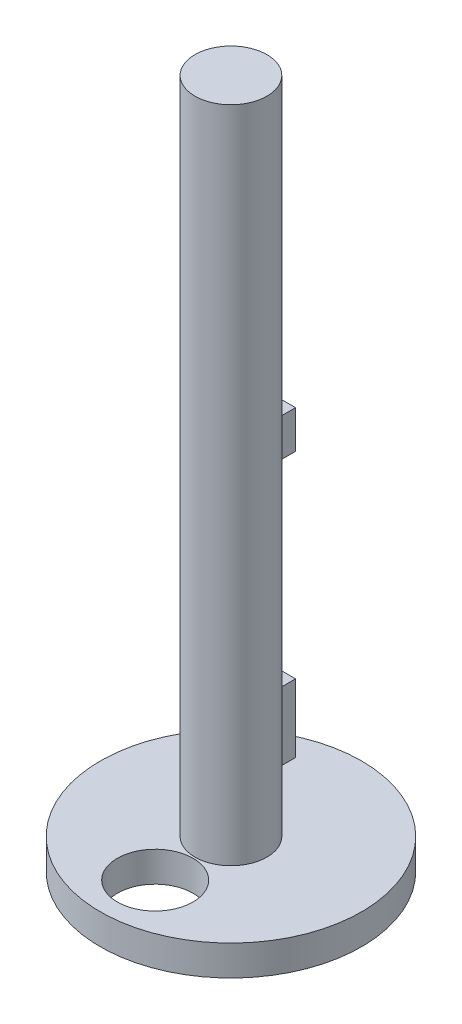
ISO-10303-21;
HEADER;
FILE_DESCRIPTION(('STEP AP214'),'2;1');
FILE_NAME('part.step','',(''),(''),'','','');
FILE_SCHEMA(('AUTOMOTIVE_DESIGN { 1 0 10303 214 1 1 1 1 }'));
ENDSEC;
DATA;
#1=APPLICATION_CONTEXT('core data for automotive mechanical design processes');
#2=APPLICATION_PROTOCOL_DEFINITION('international standard','automotive_design',2000,#1);
#3=PRODUCT_CONTEXT('',#1,'mechanical');
#4=PRODUCT('Part','Part','',(#3));
#5=PRODUCT_RELATED_PRODUCT_CATEGORY('part','',(#4));
#6=PRODUCT_DEFINITION_FORMATION('','',#4);
#7=PRODUCT_DEFINITION_CONTEXT('part definition',#1,'design');
#8=PRODUCT_DEFINITION('design','',#6,#7);
#9=PRODUCT_DEFINITION_SHAPE('','',#8);
#10=(LENGTH_UNIT() NAMED_UNIT(*) SI_UNIT(.MILLI.,.METRE.));
#11=(NAMED_UNIT(*) PLANE_ANGLE_UNIT() SI_UNIT($,.RADIAN.));
#12=(NAMED_UNIT(*) SI_UNIT($,.STERADIAN.) SOLID_ANGLE_UNIT());
#13=UNCERTAINTY_MEASURE_WITH_UNIT(LENGTH_MEASURE(1.E-05),#10,'distance_accuracy_value','');
#14=(GEOMETRIC_REPRESENTATION_CONTEXT(3) GLOBAL_UNCERTAINTY_ASSIGNED_CONTEXT((#13)) GLOBAL_UNIT_ASSIGNED_CONTEXT((#10,
#11,#12)) REPRESENTATION_CONTEXT('',''));
#15=CARTESIAN_POINT('',(0.,0.,0.));
#16=DIRECTION('',(0.,0.,1.));
#17=DIRECTION('',(1.,0.,0.));
#18=AXIS2_PLACEMENT_3D('',#15,#16,#17);
#19=CARTESIAN_POINT('',(0.,87.,0.));
#20=DIRECTION('',(0.,-1.,0.));
#21=DIRECTION('',(0.,0.,-1.));
#22=AXIS2_PLACEMENT_3D('',#19,#20,#21);
#23=CYLINDRICAL_SURFACE('',#22,4.75);
#24=CARTESIAN_POINT('',(0.,15.5,0.));
#25=DIRECTION('',(0.,-1.,0.));
#26=DIRECTION('',(0.,0.,-1.));
#27=AXIS2_PLACEMENT_3D('',#24,#25,#26);
#28=CIRCLE('',#27,4.75);
#29=CARTESIAN_POINT('',(-1.75,15.5,-4.41588043316392));
#30=VERTEX_POINT('',#29);
#31=CARTESIAN_POINT('',(1.75,15.5,-4.41588043316392));
#32=VERTEX_POINT('',#31);
#33=EDGE_CURVE('E172',#30,#32,#28,.T.);
#34=ORIENTED_EDGE('',*,*,#33,.F.);
#35=DIRECTION('',(0.,-1.,0.));
#36=VECTOR('',#35,1.);
#37=CARTESIAN_POINT('',(-1.75,87.,-4.41588043316392));
#38=LINE('',#37,#36);
#39=CARTESIAN_POINT('',(-1.75,6.50000000000001,-4.41588043316392));
#40=VERTEX_POINT('',#39);
#41=EDGE_CURVE('E170',#40,#30,#38,.F.);
#42=ORIENTED_EDGE('',*,*,#41,.F.);
#43=CARTESIAN_POINT('',(0.,6.50000000000001,0.));
#44=DIRECTION('',(0.,-1.,0.));
#45=DIRECTION('',(0.,0.,-1.));
#46=AXIS2_PLACEMENT_3D('',#43,#44,#45);
#47=CIRCLE('',#46,4.75);
#48=CARTESIAN_POINT('',(1.75,6.50000000000001,-4.41588043316392));
#49=VERTEX_POINT('',#48);
#50=EDGE_CURVE('E163',#40,#49,#47,.T.);
#51=ORIENTED_EDGE('',*,*,#50,.T.);
#52=DIRECTION('',(0.,-1.,0.));
#53=VECTOR('',#52,1.);
#54=CARTESIAN_POINT('',(1.75,87.,-4.41588043316392));
#55=LINE('',#54,#53);
#56=EDGE_CURVE('E168',#32,#49,#55,.T.);
#57=ORIENTED_EDGE('',*,*,#56,.F.);
#58=EDGE_LOOP('',(#34,#42,#51,#57));
#59=FACE_BOUND('',#58,.T.);
#60=CARTESIAN_POINT('',(0.,87.,0.));
#61=DIRECTION('',(0.,1.,0.));
#62=DIRECTION('',(0.,0.,1.));
#63=AXIS2_PLACEMENT_3D('',#60,#61,#62);
#64=CIRCLE('',#63,4.75);
#65=CARTESIAN_POINT('',(0.,87.,4.75));
#66=VERTEX_POINT('',#65);
#67=EDGE_CURVE('E160',#66,#66,#64,.T.);
#68=ORIENTED_EDGE('',*,*,#67,.F.);
#69=EDGE_LOOP('',(#68));
#70=FACE_BOUND('',#69,.T.);
#71=CARTESIAN_POINT('',(0.,0.,0.));
#72=DIRECTION('',(0.,1.,0.));
#73=DIRECTION('',(0.,0.,1.));
#74=AXIS2_PLACEMENT_3D('',#71,#72,#73);
#75=CIRCLE('',#74,4.75);
#76=CARTESIAN_POINT('',(0.,0.,4.75));
#77=VERTEX_POINT('',#76);
#78=EDGE_CURVE('E157',#77,#77,#75,.T.);
#79=ORIENTED_EDGE('',*,*,#78,.T.);
#80=EDGE_LOOP('',(#79));
#81=FACE_BOUND('',#80,.T.);
#82=CARTESIAN_POINT('',(0.,46.5,0.));
#83=DIRECTION('',(0.,-1.,0.));
#84=DIRECTION('',(0.,0.,-1.));
#85=AXIS2_PLACEMENT_3D('',#82,#83,#84);
#86=CIRCLE('',#85,4.75);
#87=CARTESIAN_POINT('',(-1.75,46.5,-4.41588043316392));
#88=VERTEX_POINT('',#87);
#89=CARTESIAN_POINT('',(1.75,46.5,-4.41588043316392));
#90=VERTEX_POINT('',#89);
#91=EDGE_CURVE('E11',#88,#90,#86,.T.);
#92=ORIENTED_EDGE('',*,*,#91,.F.);
#93=DIRECTION('',(0.,-1.,0.));
#94=VECTOR('',#93,1.);
#95=CARTESIAN_POINT('',(-1.75,87.,-4.41588043316392));
#96=LINE('',#95,#94);
#97=CARTESIAN_POINT('',(-1.75,41.5,-4.41588043316392));
#98=VERTEX_POINT('',#97);
#99=EDGE_CURVE('E42',#98,#88,#96,.F.);
#100=ORIENTED_EDGE('',*,*,#99,.F.);
#101=CARTESIAN_POINT('',(0.,41.5,0.));
#102=DIRECTION('',(0.,-1.,0.));
#103=DIRECTION('',(0.,0.,-1.));
#104=AXIS2_PLACEMENT_3D('',#101,#102,#103);
#105=CIRCLE('',#104,4.75);
#106=CARTESIAN_POINT('',(1.75,41.5,-4.41588043316392));
#107=VERTEX_POINT('',#106);
#108=EDGE_CURVE('E174',#98,#107,#105,.T.);
#109=ORIENTED_EDGE('',*,*,#108,.T.);
#110=DIRECTION('',(0.,-1.,0.));
#111=VECTOR('',#110,1.);
#112=CARTESIAN_POINT('',(1.75,87.,-4.41588043316392));
#113=LINE('',#112,#111);
#114=EDGE_CURVE('E177',#90,#107,#113,.T.);
#115=ORIENTED_EDGE('',*,*,#114,.F.);
#116=EDGE_LOOP('',(#92,#100,#109,#115));
#117=FACE_BOUND('',#116,.T.);
#118=ADVANCED_FACE('F35',(#59,#70,#81,#117),#23,.T.);
#119=CARTESIAN_POINT('',(0.,87.,0.));
#120=DIRECTION('',(0.,1.,0.));
#121=DIRECTION('',(0.,0.,1.));
#122=AXIS2_PLACEMENT_3D('',#119,#120,#121);
#123=PLANE('',#122);
#124=ORIENTED_EDGE('',*,*,#67,.T.);
#125=EDGE_LOOP('',(#124));
#126=FACE_BOUND('',#125,.T.);
#127=ADVANCED_FACE('F192',(#126),#123,.T.);
#128=CARTESIAN_POINT('',(0.,-4.,0.));
#129=DIRECTION('',(0.,1.,0.));
#130=DIRECTION('',(0.,0.,1.));
#131=AXIS2_PLACEMENT_3D('',#128,#129,#130);
#132=CYLINDRICAL_SURFACE('',#131,17.25);
#133=CARTESIAN_POINT('',(0.,-4.,0.));
#134=DIRECTION('',(0.,-1.,0.));
#135=DIRECTION('',(0.,0.,-1.));
#136=AXIS2_PLACEMENT_3D('',#133,#134,#135);
#137=CIRCLE('',#136,17.25);
#138=CARTESIAN_POINT('',(0.,-4.,-17.25));
#139=VERTEX_POINT('',#138);
#140=EDGE_CURVE('E154',#139,#139,#137,.T.);
#141=ORIENTED_EDGE('',*,*,#140,.F.);
#142=EDGE_LOOP('',(#141));
#143=FACE_BOUND('',#142,.T.);
#144=CARTESIAN_POINT('',(0.,0.,0.));
#145=DIRECTION('',(0.,-1.,0.));
#146=DIRECTION('',(0.,0.,-1.));
#147=AXIS2_PLACEMENT_3D('',#144,#145,#146);
#148=CIRCLE('',#147,17.25);
#149=CARTESIAN_POINT('',(0.,0.,-17.25));
#150=VERTEX_POINT('',#149);
#151=EDGE_CURVE('E151',#150,#150,#148,.T.);
#152=ORIENTED_EDGE('',*,*,#151,.T.);
#153=EDGE_LOOP('',(#152));
#154=FACE_BOUND('',#153,.T.);
#155=ADVANCED_FACE('F199',(#143,#154),#132,.T.);
#156=CARTESIAN_POINT('',(0.,-4.,0.));
#157=DIRECTION('',(0.,-1.,0.));
#158=DIRECTION('',(0.,0.,-1.));
#159=AXIS2_PLACEMENT_3D('',#156,#157,#158);
#160=PLANE('',#159);
#161=CARTESIAN_POINT('',(0.,-4.,10.));
#162=DIRECTION('',(0.,-1.,0.));
#163=DIRECTION('',(0.,0.,-1.));
#164=AXIS2_PLACEMENT_3D('',#161,#162,#163);
#165=CIRCLE('',#164,5.);
#166=CARTESIAN_POINT('',(0.,-4.,5.));
#167=VERTEX_POINT('',#166);
#168=EDGE_CURVE('E147',#167,#167,#165,.T.);
#169=ORIENTED_EDGE('',*,*,#168,.F.);
#170=EDGE_LOOP('',(#169));
#171=FACE_BOUND('',#170,.T.);
#172=ORIENTED_EDGE('',*,*,#140,.T.);
#173=EDGE_LOOP('',(#172));
#174=FACE_BOUND('',#173,.T.);
#175=ADVANCED_FACE('F213',(#171,#174),#160,.T.);
#176=CARTESIAN_POINT('',(0.,0.,0.));
#177=DIRECTION('',(0.,-1.,0.));
#178=DIRECTION('',(0.,0.,-1.));
#179=AXIS2_PLACEMENT_3D('',#176,#177,#178);
#180=PLANE('',#179);
#181=CARTESIAN_POINT('',(0.,0.,10.));
#182=DIRECTION('',(0.,-1.,0.));
#183=DIRECTION('',(0.,0.,-1.));
#184=AXIS2_PLACEMENT_3D('',#181,#182,#183);
#185=CIRCLE('',#184,5.);
#186=CARTESIAN_POINT('',(0.,0.,5.));
#187=VERTEX_POINT('',#186);
#188=EDGE_CURVE('E148',#187,#187,#185,.T.);
#189=ORIENTED_EDGE('',*,*,#188,.T.);
#190=EDGE_LOOP('',(#189));
#191=FACE_BOUND('',#190,.T.);
#192=ORIENTED_EDGE('',*,*,#78,.F.);
#193=EDGE_LOOP('',(#192));
#194=FACE_BOUND('',#193,.T.);
#195=ORIENTED_EDGE('',*,*,#151,.F.);
#196=EDGE_LOOP('',(#195));
#197=FACE_BOUND('',#196,.T.);
#198=ADVANCED_FACE('F209',(#191,#194,#197),#180,.F.);
#199=CARTESIAN_POINT('',(0.,0.,10.));
#200=DIRECTION('',(0.,-1.,0.));
#201=DIRECTION('',(0.,0.,-1.));
#202=AXIS2_PLACEMENT_3D('',#199,#200,#201);
#203=CYLINDRICAL_SURFACE('',#202,5.);
#204=ORIENTED_EDGE('',*,*,#188,.F.);
#205=EDGE_LOOP('',(#204));
#206=FACE_BOUND('',#205,.T.);
#207=ORIENTED_EDGE('',*,*,#168,.T.);
#208=EDGE_LOOP('',(#207));
#209=FACE_BOUND('',#208,.T.);
#210=ADVANCED_FACE('F212',(#206,#209),#203,.F.);
#211=CARTESIAN_POINT('',(-1.75,15.5,0.));
#212=DIRECTION('',(1.,0.,0.));
#213=DIRECTION('',(0.,0.,-1.));
#214=AXIS2_PLACEMENT_3D('',#211,#212,#213);
#215=PLANE('',#214);
#216=DIRECTION('',(0.,0.,1.));
#217=VECTOR('',#216,1.);
#218=CARTESIAN_POINT('',(-1.75,6.5,0.));
#219=LINE('',#218,#217);
#220=CARTESIAN_POINT('',(-1.75,6.5,-6.77772085586298));
#221=VERTEX_POINT('',#220);
#222=EDGE_CURVE('E113',#221,#40,#219,.T.);
#223=ORIENTED_EDGE('',*,*,#222,.T.);
#224=ORIENTED_EDGE('',*,*,#41,.T.);
#225=DIRECTION('',(0.,0.,1.));
#226=VECTOR('',#225,1.);
#227=CARTESIAN_POINT('',(-1.75,15.5,0.));
#228=LINE('',#227,#226);
#229=CARTESIAN_POINT('',(-1.75,15.5,-6.77772085586298));
#230=VERTEX_POINT('',#229);
#231=EDGE_CURVE('E129',#230,#30,#228,.T.);
#232=ORIENTED_EDGE('',*,*,#231,.F.);
#233=DIRECTION('',(0.,-1.,0.));
#234=VECTOR('',#233,1.);
#235=CARTESIAN_POINT('',(-1.75,15.5,-6.77772085586298));
#236=LINE('',#235,#234);
#237=EDGE_CURVE('E137',#230,#221,#236,.T.);
#238=ORIENTED_EDGE('',*,*,#237,.T.);
#239=EDGE_LOOP('',(#223,#224,#232,#238));
#240=FACE_BOUND('',#239,.T.);
#241=ADVANCED_FACE('F230',(#240),#215,.F.);
#242=CARTESIAN_POINT('',(1.75,15.5,0.));
#243=DIRECTION('',(-1.,0.,0.));
#244=DIRECTION('',(0.,0.,1.));
#245=AXIS2_PLACEMENT_3D('',#242,#243,#244);
#246=PLANE('',#245);
#247=DIRECTION('',(0.,0.,-1.));
#248=VECTOR('',#247,1.);
#249=CARTESIAN_POINT('',(1.75,15.5,0.));
#250=LINE('',#249,#248);
#251=CARTESIAN_POINT('',(1.75,15.5,-6.77772085586298));
#252=VERTEX_POINT('',#251);
#253=EDGE_CURVE('E132',#32,#252,#250,.T.);
#254=ORIENTED_EDGE('',*,*,#253,.F.);
#255=ORIENTED_EDGE('',*,*,#56,.T.);
#256=DIRECTION('',(0.,0.,-1.));
#257=VECTOR('',#256,1.);
#258=CARTESIAN_POINT('',(1.75,6.5,0.));
#259=LINE('',#258,#257);
#260=CARTESIAN_POINT('',(1.75,6.5,-6.77772085586298));
#261=VERTEX_POINT('',#260);
#262=EDGE_CURVE('E57',#49,#261,#259,.T.);
#263=ORIENTED_EDGE('',*,*,#262,.T.);
#264=DIRECTION('',(0.,-1.,0.));
#265=VECTOR('',#264,1.);
#266=CARTESIAN_POINT('',(1.75,15.5,-6.77772085586298));
#267=LINE('',#266,#265);
#268=EDGE_CURVE('E144',#252,#261,#267,.T.);
#269=ORIENTED_EDGE('',*,*,#268,.F.);
#270=EDGE_LOOP('',(#254,#255,#263,#269));
#271=FACE_BOUND('',#270,.T.);
#272=ADVANCED_FACE('F234',(#271),#246,.F.);
#273=CARTESIAN_POINT('',(-1.75,15.5,-6.77772085586298));
#274=DIRECTION('',(0.,0.,1.));
#275=DIRECTION('',(1.,0.,0.));
#276=AXIS2_PLACEMENT_3D('',#273,#274,#275);
#277=PLANE('',#276);
#278=DIRECTION('',(-1.,0.,0.));
#279=VECTOR('',#278,1.);
#280=CARTESIAN_POINT('',(-1.75,6.5,-6.77772085586298));
#281=LINE('',#280,#279);
#282=EDGE_CURVE('E133',#261,#221,#281,.T.);
#283=ORIENTED_EDGE('',*,*,#282,.T.);
#284=ORIENTED_EDGE('',*,*,#237,.F.);
#285=DIRECTION('',(-1.,0.,0.));
#286=VECTOR('',#285,1.);
#287=CARTESIAN_POINT('',(-1.75,15.5,-6.77772085586298));
#288=LINE('',#287,#286);
#289=EDGE_CURVE('E135',#252,#230,#288,.T.);
#290=ORIENTED_EDGE('',*,*,#289,.F.);
#291=ORIENTED_EDGE('',*,*,#268,.T.);
#292=EDGE_LOOP('',(#283,#284,#290,#291));
#293=FACE_BOUND('',#292,.T.);
#294=ADVANCED_FACE('F238',(#293),#277,.F.);
#295=CARTESIAN_POINT('',(0.,15.5,0.));
#296=DIRECTION('',(0.,-1.,0.));
#297=DIRECTION('',(0.,0.,-1.));
#298=AXIS2_PLACEMENT_3D('',#295,#296,#297);
#299=PLANE('',#298);
#300=ORIENTED_EDGE('',*,*,#231,.T.);
#301=ORIENTED_EDGE('',*,*,#33,.T.);
#302=ORIENTED_EDGE('',*,*,#253,.T.);
#303=ORIENTED_EDGE('',*,*,#289,.T.);
#304=EDGE_LOOP('',(#300,#301,#302,#303));
#305=FACE_BOUND('',#304,.T.);
#306=ADVANCED_FACE('F242',(#305),#299,.F.);
#307=CARTESIAN_POINT('',(0.,6.5,0.));
#308=DIRECTION('',(0.,-1.,0.));
#309=DIRECTION('',(0.,0.,-1.));
#310=AXIS2_PLACEMENT_3D('',#307,#308,#309);
#311=PLANE('',#310);
#312=ORIENTED_EDGE('',*,*,#50,.F.);
#313=ORIENTED_EDGE('',*,*,#222,.F.);
#314=ORIENTED_EDGE('',*,*,#282,.F.);
#315=ORIENTED_EDGE('',*,*,#262,.F.);
#316=EDGE_LOOP('',(#312,#313,#314,#315));
#317=FACE_BOUND('',#316,.T.);
#318=ADVANCED_FACE('F244',(#317),#311,.T.);
#319=CARTESIAN_POINT('',(-1.75,46.5,0.));
#320=DIRECTION('',(1.,0.,0.));
#321=DIRECTION('',(0.,0.,-1.));
#322=AXIS2_PLACEMENT_3D('',#319,#320,#321);
#323=PLANE('',#322);
#324=DIRECTION('',(0.,0.,1.));
#325=VECTOR('',#324,1.);
#326=CARTESIAN_POINT('',(-1.75,41.5,0.));
#327=LINE('',#326,#325);
#328=CARTESIAN_POINT('',(-1.75,41.5,-6.77772085586298));
#329=VERTEX_POINT('',#328);
#330=EDGE_CURVE('E123',#329,#98,#327,.T.);
#331=ORIENTED_EDGE('',*,*,#330,.T.);
#332=ORIENTED_EDGE('',*,*,#99,.T.);
#333=DIRECTION('',(0.,0.,1.));
#334=VECTOR('',#333,1.);
#335=CARTESIAN_POINT('',(-1.75,46.5,0.));
#336=LINE('',#335,#334);
#337=CARTESIAN_POINT('',(-1.75,46.5,-6.77772085586298));
#338=VERTEX_POINT('',#337);
#339=EDGE_CURVE('E107',#338,#88,#336,.T.);
#340=ORIENTED_EDGE('',*,*,#339,.F.);
#341=DIRECTION('',(0.,-1.,0.));
#342=VECTOR('',#341,1.);
#343=CARTESIAN_POINT('',(-1.75,46.5,-6.77772085586298));
#344=LINE('',#343,#342);
#345=EDGE_CURVE('E114',#338,#329,#344,.T.);
#346=ORIENTED_EDGE('',*,*,#345,.T.);
#347=EDGE_LOOP('',(#331,#332,#340,#346));
#348=FACE_BOUND('',#347,.T.);
#349=ADVANCED_FACE('F180',(#348),#323,.F.);
#350=CARTESIAN_POINT('',(1.75,46.5,0.));
#351=DIRECTION('',(-1.,0.,0.));
#352=DIRECTION('',(0.,0.,1.));
#353=AXIS2_PLACEMENT_3D('',#350,#351,#352);
#354=PLANE('',#353);
#355=DIRECTION('',(0.,0.,-1.));
#356=VECTOR('',#355,1.);
#357=CARTESIAN_POINT('',(1.75,46.5,0.));
#358=LINE('',#357,#356);
#359=CARTESIAN_POINT('',(1.75,46.5,-6.77772085586298));
#360=VERTEX_POINT('',#359);
#361=EDGE_CURVE('E97',#90,#360,#358,.T.);
#362=ORIENTED_EDGE('',*,*,#361,.F.);
#363=ORIENTED_EDGE('',*,*,#114,.T.);
#364=DIRECTION('',(0.,0.,-1.));
#365=VECTOR('',#364,1.);
#366=CARTESIAN_POINT('',(1.75,41.5,0.));
#367=LINE('',#366,#365);
#368=CARTESIAN_POINT('',(1.75,41.5,-6.77772085586298));
#369=VERTEX_POINT('',#368);
#370=EDGE_CURVE('E49',#107,#369,#367,.T.);
#371=ORIENTED_EDGE('',*,*,#370,.T.);
#372=DIRECTION('',(0.,-1.,0.));
#373=VECTOR('',#372,1.);
#374=CARTESIAN_POINT('',(1.75,46.5,-6.77772085586298));
#375=LINE('',#374,#373);
#376=EDGE_CURVE('E110',#360,#369,#375,.T.);
#377=ORIENTED_EDGE('',*,*,#376,.F.);
#378=EDGE_LOOP('',(#362,#363,#371,#377));
#379=FACE_BOUND('',#378,.T.);
#380=ADVANCED_FACE('F111',(#379),#354,.F.);
#381=CARTESIAN_POINT('',(-1.75,46.5,-6.77772085586298));
#382=DIRECTION('',(0.,0.,1.));
#383=DIRECTION('',(1.,0.,0.));
#384=AXIS2_PLACEMENT_3D('',#381,#382,#383);
#385=PLANE('',#384);
#386=DIRECTION('',(-1.,0.,0.));
#387=VECTOR('',#386,1.);
#388=CARTESIAN_POINT('',(-1.75,41.5,-6.77772085586298));
#389=LINE('',#388,#387);
#390=EDGE_CURVE('E127',#369,#329,#389,.T.);
#391=ORIENTED_EDGE('',*,*,#390,.T.);
#392=ORIENTED_EDGE('',*,*,#345,.F.);
#393=DIRECTION('',(-1.,0.,0.));
#394=VECTOR('',#393,1.);
#395=CARTESIAN_POINT('',(-1.75,46.5,-6.77772085586298));
#396=LINE('',#395,#394);
#397=EDGE_CURVE('E102',#360,#338,#396,.T.);
#398=ORIENTED_EDGE('',*,*,#397,.F.);
#399=ORIENTED_EDGE('',*,*,#376,.T.);
#400=EDGE_LOOP('',(#391,#392,#398,#399));
#401=FACE_BOUND('',#400,.T.);
#402=ADVANCED_FACE('F116',(#401),#385,.F.);
#403=CARTESIAN_POINT('',(0.,46.5,0.));
#404=DIRECTION('',(0.,-1.,0.));
#405=DIRECTION('',(0.,0.,-1.));
#406=AXIS2_PLACEMENT_3D('',#403,#404,#405);
#407=PLANE('',#406);
#408=ORIENTED_EDGE('',*,*,#339,.T.);
#409=ORIENTED_EDGE('',*,*,#91,.T.);
#410=ORIENTED_EDGE('',*,*,#361,.T.);
#411=ORIENTED_EDGE('',*,*,#397,.T.);
#412=EDGE_LOOP('',(#408,#409,#410,#411));
#413=FACE_BOUND('',#412,.T.);
#414=ADVANCED_FACE('F100',(#413),#407,.F.);
#415=CARTESIAN_POINT('',(0.,41.5,0.));
#416=DIRECTION('',(0.,-1.,0.));
#417=DIRECTION('',(0.,0.,-1.));
#418=AXIS2_PLACEMENT_3D('',#415,#416,#417);
#419=PLANE('',#418);
#420=ORIENTED_EDGE('',*,*,#108,.F.);
#421=ORIENTED_EDGE('',*,*,#330,.F.);
#422=ORIENTED_EDGE('',*,*,#390,.F.);
#423=ORIENTED_EDGE('',*,*,#370,.F.);
#424=EDGE_LOOP('',(#420,#421,#422,#423));
#425=FACE_BOUND('',#424,.T.);
#426=ADVANCED_FACE('F183',(#425),#419,.T.);
#427=CLOSED_SHELL('',(#118,#127,#155,#175,#198,#210,#241,#272,#294,#306,#318,#349,#380,#402,
#414,#426));
#428=MANIFOLD_SOLID_BREP('B2',#427);
#429=ADVANCED_BREP_SHAPE_REPRESENTATION('',(#18,#428),#14);
#430=SHAPE_DEFINITION_REPRESENTATION(#9,#429);
ENDSEC;
END-ISO-10303-21;
